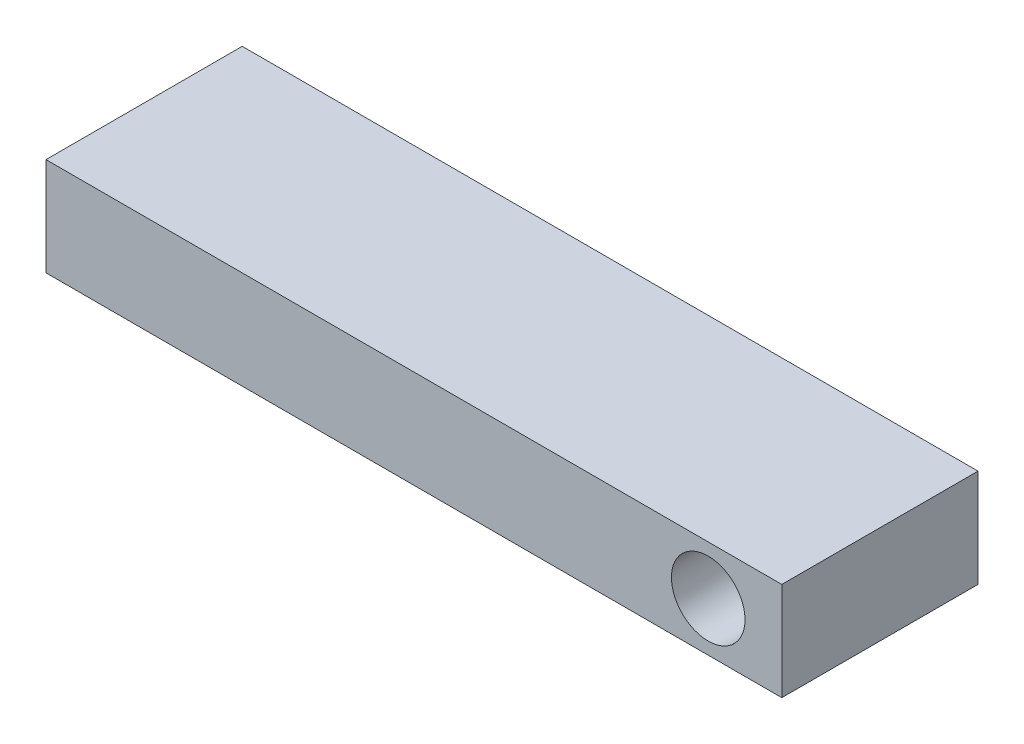
ISO-10303-21;
HEADER;
FILE_DESCRIPTION(('STEP AP214'),'2;1');
FILE_NAME('part.step','',(''),(''),'','','');
FILE_SCHEMA(('AUTOMOTIVE_DESIGN { 1 0 10303 214 1 1 1 1 }'));
ENDSEC;
DATA;
#1=APPLICATION_CONTEXT('core data for automotive mechanical design processes');
#2=APPLICATION_PROTOCOL_DEFINITION('international standard','automotive_design',2000,#1);
#3=PRODUCT_CONTEXT('',#1,'mechanical');
#4=PRODUCT('Part','Part','',(#3));
#5=PRODUCT_RELATED_PRODUCT_CATEGORY('part','',(#4));
#6=PRODUCT_DEFINITION_FORMATION('','',#4);
#7=PRODUCT_DEFINITION_CONTEXT('part definition',#1,'design');
#8=PRODUCT_DEFINITION('design','',#6,#7);
#9=PRODUCT_DEFINITION_SHAPE('','',#8);
#10=(LENGTH_UNIT() NAMED_UNIT(*) SI_UNIT(.MILLI.,.METRE.));
#11=(NAMED_UNIT(*) PLANE_ANGLE_UNIT() SI_UNIT($,.RADIAN.));
#12=(NAMED_UNIT(*) SI_UNIT($,.STERADIAN.) SOLID_ANGLE_UNIT());
#13=UNCERTAINTY_MEASURE_WITH_UNIT(LENGTH_MEASURE(1.E-05),#10,'distance_accuracy_value','');
#14=(GEOMETRIC_REPRESENTATION_CONTEXT(3) GLOBAL_UNCERTAINTY_ASSIGNED_CONTEXT((#13)) GLOBAL_UNIT_ASSIGNED_CONTEXT((#10,
#11,#12)) REPRESENTATION_CONTEXT('',''));
#15=CARTESIAN_POINT('',(0.,0.,0.));
#16=DIRECTION('',(0.,0.,1.));
#17=DIRECTION('',(1.,0.,0.));
#18=AXIS2_PLACEMENT_3D('',#15,#16,#17);
#19=CARTESIAN_POINT('',(0.,0.,25.4));
#20=DIRECTION('',(0.,0.,-1.));
#21=DIRECTION('',(-1.,0.,0.));
#22=AXIS2_PLACEMENT_3D('',#19,#20,#21);
#23=PLANE('',#22);
#24=DIRECTION('',(1.,0.,0.));
#25=VECTOR('',#24,1.);
#26=CARTESIAN_POINT('',(95.25,0.,25.4));
#27=LINE('',#26,#25);
#28=CARTESIAN_POINT('',(0.,0.,25.4));
#29=VERTEX_POINT('',#28);
#30=CARTESIAN_POINT('',(95.25,0.,25.4));
#31=VERTEX_POINT('',#30);
#32=EDGE_CURVE('E85',#29,#31,#27,.T.);
#33=ORIENTED_EDGE('',*,*,#32,.T.);
#34=DIRECTION('',(0.,1.,0.));
#35=VECTOR('',#34,1.);
#36=CARTESIAN_POINT('',(95.25,0.,25.4));
#37=LINE('',#36,#35);
#38=CARTESIAN_POINT('',(95.25,12.7,25.4));
#39=VERTEX_POINT('',#38);
#40=EDGE_CURVE('E80',#31,#39,#37,.T.);
#41=ORIENTED_EDGE('',*,*,#40,.T.);
#42=DIRECTION('',(-1.,0.,0.));
#43=VECTOR('',#42,1.);
#44=CARTESIAN_POINT('',(95.25,12.7,25.4));
#45=LINE('',#44,#43);
#46=CARTESIAN_POINT('',(0.,12.7,25.4));
#47=VERTEX_POINT('',#46);
#48=EDGE_CURVE('E83',#39,#47,#45,.T.);
#49=ORIENTED_EDGE('',*,*,#48,.T.);
#50=DIRECTION('',(0.,-1.,0.));
#51=VECTOR('',#50,1.);
#52=CARTESIAN_POINT('',(0.,0.,25.4));
#53=LINE('',#52,#51);
#54=EDGE_CURVE('E50',#47,#29,#53,.T.);
#55=ORIENTED_EDGE('',*,*,#54,.T.);
#56=EDGE_LOOP('',(#33,#41,#49,#55));
#57=FACE_BOUND('',#56,.T.);
#58=CARTESIAN_POINT('',(85.725,6.35000000000001,25.4));
#59=DIRECTION('',(0.,0.,1.));
#60=DIRECTION('',(1.,0.,0.));
#61=AXIS2_PLACEMENT_3D('',#58,#59,#60);
#62=CIRCLE('',#61,4.7625);
#63=CARTESIAN_POINT('',(90.4875,6.35000000000001,25.4));
#64=VERTEX_POINT('',#63);
#65=EDGE_CURVE('E100',#64,#64,#62,.T.);
#66=ORIENTED_EDGE('',*,*,#65,.F.);
#67=EDGE_LOOP('',(#66));
#68=FACE_BOUND('',#67,.T.);
#69=ADVANCED_FACE('F33',(#57,#68),#23,.F.);
#70=CARTESIAN_POINT('',(0.,0.,0.));
#71=DIRECTION('',(0.,0.,-1.));
#72=DIRECTION('',(-1.,0.,0.));
#73=AXIS2_PLACEMENT_3D('',#70,#71,#72);
#74=PLANE('',#73);
#75=DIRECTION('',(1.,0.,0.));
#76=VECTOR('',#75,1.);
#77=CARTESIAN_POINT('',(95.25,0.,0.));
#78=LINE('',#77,#76);
#79=CARTESIAN_POINT('',(0.,0.,0.));
#80=VERTEX_POINT('',#79);
#81=CARTESIAN_POINT('',(95.25,0.,0.));
#82=VERTEX_POINT('',#81);
#83=EDGE_CURVE('E97',#80,#82,#78,.T.);
#84=ORIENTED_EDGE('',*,*,#83,.F.);
#85=DIRECTION('',(0.,-1.,0.));
#86=VECTOR('',#85,1.);
#87=CARTESIAN_POINT('',(0.,0.,0.));
#88=LINE('',#87,#86);
#89=CARTESIAN_POINT('',(0.,12.7,0.));
#90=VERTEX_POINT('',#89);
#91=EDGE_CURVE('E73',#90,#80,#88,.T.);
#92=ORIENTED_EDGE('',*,*,#91,.F.);
#93=DIRECTION('',(-1.,0.,0.));
#94=VECTOR('',#93,1.);
#95=CARTESIAN_POINT('',(95.25,12.7,0.));
#96=LINE('',#95,#94);
#97=CARTESIAN_POINT('',(95.25,12.7,0.));
#98=VERTEX_POINT('',#97);
#99=EDGE_CURVE('E67',#98,#90,#96,.T.);
#100=ORIENTED_EDGE('',*,*,#99,.F.);
#101=DIRECTION('',(0.,1.,0.));
#102=VECTOR('',#101,1.);
#103=CARTESIAN_POINT('',(95.25,0.,0.));
#104=LINE('',#103,#102);
#105=EDGE_CURVE('E89',#82,#98,#104,.T.);
#106=ORIENTED_EDGE('',*,*,#105,.F.);
#107=EDGE_LOOP('',(#84,#92,#100,#106));
#108=FACE_BOUND('',#107,.T.);
#109=CARTESIAN_POINT('',(85.725,6.35000000000001,0.));
#110=DIRECTION('',(0.,0.,1.));
#111=DIRECTION('',(1.,0.,0.));
#112=AXIS2_PLACEMENT_3D('',#109,#110,#111);
#113=CIRCLE('',#112,4.7625);
#114=CARTESIAN_POINT('',(90.4875,6.35000000000001,0.));
#115=VERTEX_POINT('',#114);
#116=EDGE_CURVE('E112',#115,#115,#113,.T.);
#117=ORIENTED_EDGE('',*,*,#116,.T.);
#118=EDGE_LOOP('',(#117));
#119=FACE_BOUND('',#118,.T.);
#120=ADVANCED_FACE('F108',(#108,#119),#74,.T.);
#121=CARTESIAN_POINT('',(95.25,0.,25.4));
#122=DIRECTION('',(0.,1.,0.));
#123=DIRECTION('',(-1.,0.,0.));
#124=AXIS2_PLACEMENT_3D('',#121,#122,#123);
#125=PLANE('',#124);
#126=ORIENTED_EDGE('',*,*,#83,.T.);
#127=DIRECTION('',(0.,0.,-1.));
#128=VECTOR('',#127,1.);
#129=CARTESIAN_POINT('',(95.25,0.,25.4));
#130=LINE('',#129,#128);
#131=EDGE_CURVE('E11',#31,#82,#130,.T.);
#132=ORIENTED_EDGE('',*,*,#131,.F.);
#133=ORIENTED_EDGE('',*,*,#32,.F.);
#134=DIRECTION('',(0.,0.,-1.));
#135=VECTOR('',#134,1.);
#136=CARTESIAN_POINT('',(0.,0.,25.4));
#137=LINE('',#136,#135);
#138=EDGE_CURVE('E93',#29,#80,#137,.T.);
#139=ORIENTED_EDGE('',*,*,#138,.T.);
#140=EDGE_LOOP('',(#126,#132,#133,#139));
#141=FACE_BOUND('',#140,.T.);
#142=ADVANCED_FACE('F35',(#141),#125,.F.);
#143=CARTESIAN_POINT('',(95.25,0.,25.4));
#144=DIRECTION('',(-1.,0.,0.));
#145=DIRECTION('',(0.,0.,1.));
#146=AXIS2_PLACEMENT_3D('',#143,#144,#145);
#147=PLANE('',#146);
#148=ORIENTED_EDGE('',*,*,#105,.T.);
#149=DIRECTION('',(0.,0.,-1.));
#150=VECTOR('',#149,1.);
#151=CARTESIAN_POINT('',(95.25,12.7,25.4));
#152=LINE('',#151,#150);
#153=EDGE_CURVE('E42',#39,#98,#152,.T.);
#154=ORIENTED_EDGE('',*,*,#153,.F.);
#155=ORIENTED_EDGE('',*,*,#40,.F.);
#156=ORIENTED_EDGE('',*,*,#131,.T.);
#157=EDGE_LOOP('',(#148,#154,#155,#156));
#158=FACE_BOUND('',#157,.T.);
#159=ADVANCED_FACE('F88',(#158),#147,.F.);
#160=CARTESIAN_POINT('',(95.25,12.7,25.4));
#161=DIRECTION('',(0.,-1.,0.));
#162=DIRECTION('',(1.,0.,0.));
#163=AXIS2_PLACEMENT_3D('',#160,#161,#162);
#164=PLANE('',#163);
#165=ORIENTED_EDGE('',*,*,#99,.T.);
#166=DIRECTION('',(0.,0.,-1.));
#167=VECTOR('',#166,1.);
#168=CARTESIAN_POINT('',(0.,12.7,25.4));
#169=LINE('',#168,#167);
#170=EDGE_CURVE('E90',#47,#90,#169,.T.);
#171=ORIENTED_EDGE('',*,*,#170,.F.);
#172=ORIENTED_EDGE('',*,*,#48,.F.);
#173=ORIENTED_EDGE('',*,*,#153,.T.);
#174=EDGE_LOOP('',(#165,#171,#172,#173));
#175=FACE_BOUND('',#174,.T.);
#176=ADVANCED_FACE('F91',(#175),#164,.F.);
#177=CARTESIAN_POINT('',(0.,0.,25.4));
#178=DIRECTION('',(1.,0.,0.));
#179=DIRECTION('',(0.,0.,-1.));
#180=AXIS2_PLACEMENT_3D('',#177,#178,#179);
#181=PLANE('',#180);
#182=ORIENTED_EDGE('',*,*,#91,.T.);
#183=ORIENTED_EDGE('',*,*,#138,.F.);
#184=ORIENTED_EDGE('',*,*,#54,.F.);
#185=ORIENTED_EDGE('',*,*,#170,.T.);
#186=EDGE_LOOP('',(#182,#183,#184,#185));
#187=FACE_BOUND('',#186,.T.);
#188=ADVANCED_FACE('F105',(#187),#181,.F.);
#189=CARTESIAN_POINT('',(85.725,6.35000000000001,25.4));
#190=DIRECTION('',(0.,0.,-1.));
#191=DIRECTION('',(-1.,0.,0.));
#192=AXIS2_PLACEMENT_3D('',#189,#190,#191);
#193=CYLINDRICAL_SURFACE('',#192,4.7625);
#194=ORIENTED_EDGE('',*,*,#65,.T.);
#195=EDGE_LOOP('',(#194));
#196=FACE_BOUND('',#195,.T.);
#197=ORIENTED_EDGE('',*,*,#116,.F.);
#198=EDGE_LOOP('',(#197));
#199=FACE_BOUND('',#198,.T.);
#200=ADVANCED_FACE('F118',(#196,#199),#193,.F.);
#201=CLOSED_SHELL('',(#69,#120,#142,#159,#176,#188,#200));
#202=MANIFOLD_SOLID_BREP('B2',#201);
#203=ADVANCED_BREP_SHAPE_REPRESENTATION('',(#18,#202),#14);
#204=SHAPE_DEFINITION_REPRESENTATION(#9,#203);
ENDSEC;
END-ISO-10303-21;
